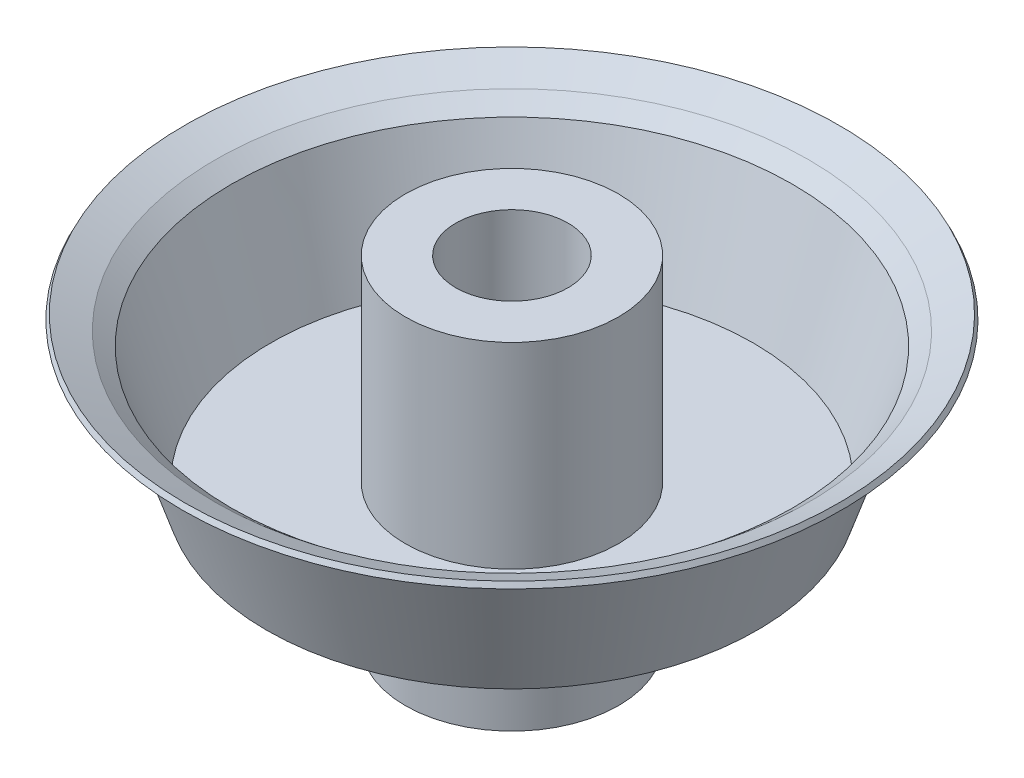
ISO-10303-21;
HEADER;
FILE_DESCRIPTION(('STEP AP214'),'2;1');
FILE_NAME('part.step','',(''),(''),'','','');
FILE_SCHEMA(('AUTOMOTIVE_DESIGN { 1 0 10303 214 1 1 1 1 }'));
ENDSEC;
DATA;
#1=APPLICATION_CONTEXT('core data for automotive mechanical design processes');
#2=APPLICATION_PROTOCOL_DEFINITION('international standard','automotive_design',2000,#1);
#3=PRODUCT_CONTEXT('',#1,'mechanical');
#4=PRODUCT('Part','Part','',(#3));
#5=PRODUCT_RELATED_PRODUCT_CATEGORY('part','',(#4));
#6=PRODUCT_DEFINITION_FORMATION('','',#4);
#7=PRODUCT_DEFINITION_CONTEXT('part definition',#1,'design');
#8=PRODUCT_DEFINITION('design','',#6,#7);
#9=PRODUCT_DEFINITION_SHAPE('','',#8);
#10=(LENGTH_UNIT() NAMED_UNIT(*) SI_UNIT(.MILLI.,.METRE.));
#11=(NAMED_UNIT(*) PLANE_ANGLE_UNIT() SI_UNIT($,.RADIAN.));
#12=(NAMED_UNIT(*) SI_UNIT($,.STERADIAN.) SOLID_ANGLE_UNIT());
#13=UNCERTAINTY_MEASURE_WITH_UNIT(LENGTH_MEASURE(1.E-05),#10,'distance_accuracy_value','');
#14=(GEOMETRIC_REPRESENTATION_CONTEXT(3) GLOBAL_UNCERTAINTY_ASSIGNED_CONTEXT((#13)) GLOBAL_UNIT_ASSIGNED_CONTEXT((#10,
#11,#12)) REPRESENTATION_CONTEXT('',''));
#15=CARTESIAN_POINT('',(0.,0.,0.));
#16=DIRECTION('',(0.,0.,1.));
#17=DIRECTION('',(1.,0.,0.));
#18=AXIS2_PLACEMENT_3D('',#15,#16,#17);
#19=CARTESIAN_POINT('',(0.,22.482072549379,0.));
#20=DIRECTION('',(0.,1.,0.));
#21=DIRECTION('',(0.,0.,1.));
#22=AXIS2_PLACEMENT_3D('',#19,#20,#21);
#23=CONICAL_SURFACE('',#22,53.4284746095807,1.11990759501973);
#24=CARTESIAN_POINT('',(0.,25.052946122985,0.));
#25=DIRECTION('',(0.,1.,0.));
#26=DIRECTION('',(0.,0.,1.));
#27=AXIS2_PLACEMENT_3D('',#24,#25,#26);
#28=CIRCLE('',#27,58.738533119433);
#29=CARTESIAN_POINT('',(0.,25.052946122985,58.738533119433));
#30=VERTEX_POINT('',#29);
#31=EDGE_CURVE('E62',#30,#30,#28,.T.);
#32=ORIENTED_EDGE('',*,*,#31,.F.);
#33=EDGE_LOOP('',(#32));
#34=FACE_BOUND('',#33,.T.);
#35=CARTESIAN_POINT('',(0.,22.482072549379,0.));
#36=DIRECTION('',(0.,1.,0.));
#37=DIRECTION('',(0.,0.,1.));
#38=AXIS2_PLACEMENT_3D('',#35,#36,#37);
#39=CIRCLE('',#38,53.4284746095807);
#40=CARTESIAN_POINT('',(0.,22.482072549379,53.4284746095807));
#41=VERTEX_POINT('',#40);
#42=EDGE_CURVE('E10',#41,#41,#39,.T.);
#43=ORIENTED_EDGE('',*,*,#42,.T.);
#44=EDGE_LOOP('',(#43));
#45=FACE_BOUND('',#44,.T.);
#46=ADVANCED_FACE('F31',(#34,#45),#23,.T.);
#47=CARTESIAN_POINT('',(0.,20.4058385928895,0.));
#48=DIRECTION('',(0.,1.,0.));
#49=DIRECTION('',(0.,0.,1.));
#50=AXIS2_PLACEMENT_3D('',#47,#48,#49);
#51=CONICAL_SURFACE('',#50,50.8560387510196,0.891736147908962);
#52=ORIENTED_EDGE('',*,*,#42,.F.);
#53=EDGE_LOOP('',(#52));
#54=FACE_BOUND('',#53,.T.);
#55=CARTESIAN_POINT('',(0.,20.4058385928895,0.));
#56=DIRECTION('',(0.,1.,0.));
#57=DIRECTION('',(0.,0.,1.));
#58=AXIS2_PLACEMENT_3D('',#55,#56,#57);
#59=CIRCLE('',#58,50.8560387510196);
#60=CARTESIAN_POINT('',(0.,20.4058385928895,50.8560387510196));
#61=VERTEX_POINT('',#60);
#62=EDGE_CURVE('E37',#61,#61,#59,.T.);
#63=ORIENTED_EDGE('',*,*,#62,.T.);
#64=EDGE_LOOP('',(#63));
#65=FACE_BOUND('',#64,.T.);
#66=ADVANCED_FACE('F100',(#54,#65),#51,.T.);
#67=CARTESIAN_POINT('',(0.,-1.00000000000821,0.));
#68=DIRECTION('',(0.,1.,0.));
#69=DIRECTION('',(0.,0.,1.));
#70=AXIS2_PLACEMENT_3D('',#67,#68,#69);
#71=CONICAL_SURFACE('',#70,43.7207592200747,0.321750554395756);
#72=ORIENTED_EDGE('',*,*,#62,.F.);
#73=EDGE_LOOP('',(#72));
#74=FACE_BOUND('',#73,.T.);
#75=CARTESIAN_POINT('',(0.,-1.00000000000821,0.));
#76=DIRECTION('',(0.,1.,0.));
#77=DIRECTION('',(0.,0.,1.));
#78=AXIS2_PLACEMENT_3D('',#75,#76,#77);
#79=CIRCLE('',#78,43.7207592200747);
#80=CARTESIAN_POINT('',(0.,-1.00000000000821,43.7207592200747));
#81=VERTEX_POINT('',#80);
#82=EDGE_CURVE('E41',#81,#81,#79,.T.);
#83=ORIENTED_EDGE('',*,*,#82,.T.);
#84=EDGE_LOOP('',(#83));
#85=FACE_BOUND('',#84,.T.);
#86=ADVANCED_FACE('F105',(#74,#85),#71,.T.);
#87=CARTESIAN_POINT('',(19.0000000000179,-1.00000000000821,0.));
#88=DIRECTION('',(0.,1.,0.));
#89=DIRECTION('',(0.,0.,1.));
#90=AXIS2_PLACEMENT_3D('',#87,#88,#89);
#91=PLANE('',#90);
#92=ORIENTED_EDGE('',*,*,#82,.F.);
#93=EDGE_LOOP('',(#92));
#94=FACE_BOUND('',#93,.T.);
#95=CARTESIAN_POINT('',(0.,-1.00000000000821,0.));
#96=DIRECTION('',(0.,1.,0.));
#97=DIRECTION('',(0.,0.,1.));
#98=AXIS2_PLACEMENT_3D('',#95,#96,#97);
#99=CIRCLE('',#98,19.0000000000179);
#100=CARTESIAN_POINT('',(0.,-1.00000000000821,19.0000000000179));
#101=VERTEX_POINT('',#100);
#102=EDGE_CURVE('E65',#101,#101,#99,.F.);
#103=ORIENTED_EDGE('',*,*,#102,.F.);
#104=EDGE_LOOP('',(#103));
#105=FACE_BOUND('',#104,.T.);
#106=ADVANCED_FACE('F136',(#94,#105),#91,.F.);
#107=CARTESIAN_POINT('',(19.0000000000179,-8.20985384275657E-12,0.));
#108=DIRECTION('',(0.,1.,0.));
#109=DIRECTION('',(0.,0.,1.));
#110=AXIS2_PLACEMENT_3D('',#107,#108,#109);
#111=PLANE('',#110);
#112=CARTESIAN_POINT('',(0.,-8.20985384275657E-12,0.));
#113=DIRECTION('',(0.,1.,0.));
#114=DIRECTION('',(0.,0.,1.));
#115=AXIS2_PLACEMENT_3D('',#112,#113,#114);
#116=CIRCLE('',#115,43.0000000000179);
#117=CARTESIAN_POINT('',(0.,-8.20985384275657E-12,43.0000000000179));
#118=VERTEX_POINT('',#117);
#119=EDGE_CURVE('E50',#118,#118,#116,.T.);
#120=ORIENTED_EDGE('',*,*,#119,.T.);
#121=EDGE_LOOP('',(#120));
#122=FACE_BOUND('',#121,.T.);
#123=CARTESIAN_POINT('',(0.,-8.20985384275657E-12,0.));
#124=DIRECTION('',(0.,1.,0.));
#125=DIRECTION('',(0.,0.,1.));
#126=AXIS2_PLACEMENT_3D('',#123,#124,#125);
#127=CIRCLE('',#126,19.0000000000179);
#128=CARTESIAN_POINT('',(0.,-8.20985384275657E-12,19.0000000000179));
#129=VERTEX_POINT('',#128);
#130=EDGE_CURVE('E45',#129,#129,#127,.T.);
#131=ORIENTED_EDGE('',*,*,#130,.F.);
#132=EDGE_LOOP('',(#131));
#133=FACE_BOUND('',#132,.T.);
#134=ADVANCED_FACE('F130',(#122,#133),#111,.T.);
#135=CARTESIAN_POINT('',(0.,-8.20985384275657E-12,0.));
#136=DIRECTION('',(0.,1.,0.));
#137=DIRECTION('',(0.,0.,1.));
#138=AXIS2_PLACEMENT_3D('',#135,#136,#137);
#139=CONICAL_SURFACE('',#138,43.0000000000179,0.321750554395756);
#140=CARTESIAN_POINT('',(0.,21.,0.));
#141=DIRECTION('',(0.,1.,0.));
#142=DIRECTION('',(0.,0.,1.));
#143=AXIS2_PLACEMENT_3D('',#140,#141,#142);
#144=CIRCLE('',#143,50.);
#145=CARTESIAN_POINT('',(0.,21.,50.));
#146=VERTEX_POINT('',#145);
#147=EDGE_CURVE('E53',#146,#146,#144,.T.);
#148=ORIENTED_EDGE('',*,*,#147,.T.);
#149=EDGE_LOOP('',(#148));
#150=FACE_BOUND('',#149,.T.);
#151=ORIENTED_EDGE('',*,*,#119,.F.);
#152=EDGE_LOOP('',(#151));
#153=FACE_BOUND('',#152,.T.);
#154=ADVANCED_FACE('F124',(#150,#153),#139,.F.);
#155=CARTESIAN_POINT('',(0.,21.,0.));
#156=DIRECTION('',(0.,1.,0.));
#157=DIRECTION('',(0.,0.,1.));
#158=AXIS2_PLACEMENT_3D('',#155,#156,#157);
#159=CONICAL_SURFACE('',#158,50.,0.891736147908962);
#160=CARTESIAN_POINT('',(0.,23.332201275954,0.));
#161=DIRECTION('',(0.,1.,0.));
#162=DIRECTION('',(0.,0.,1.));
#163=AXIS2_PLACEMENT_3D('',#160,#161,#162);
#164=CIRCLE('',#163,52.8895771465901);
#165=CARTESIAN_POINT('',(0.,23.332201275954,52.8895771465901));
#166=VERTEX_POINT('',#165);
#167=EDGE_CURVE('E56',#166,#166,#164,.T.);
#168=ORIENTED_EDGE('',*,*,#167,.T.);
#169=EDGE_LOOP('',(#168));
#170=FACE_BOUND('',#169,.T.);
#171=ORIENTED_EDGE('',*,*,#147,.F.);
#172=EDGE_LOOP('',(#171));
#173=FACE_BOUND('',#172,.T.);
#174=ADVANCED_FACE('F118',(#170,#173),#159,.F.);
#175=CARTESIAN_POINT('',(0.,23.332201275954,0.));
#176=DIRECTION('',(0.,1.,0.));
#177=DIRECTION('',(0.,0.,1.));
#178=AXIS2_PLACEMENT_3D('',#175,#176,#177);
#179=CONICAL_SURFACE('',#178,52.8895771465901,1.11990759501973);
#180=CARTESIAN_POINT('',(0.,25.9530063020908,0.));
#181=DIRECTION('',(0.,1.,0.));
#182=DIRECTION('',(0.,0.,1.));
#183=AXIS2_PLACEMENT_3D('',#180,#181,#182);
#184=CIRCLE('',#183,58.3027675012528);
#185=CARTESIAN_POINT('',(0.,25.9530063020908,58.3027675012528));
#186=VERTEX_POINT('',#185);
#187=EDGE_CURVE('E59',#186,#186,#184,.T.);
#188=ORIENTED_EDGE('',*,*,#187,.T.);
#189=EDGE_LOOP('',(#188));
#190=FACE_BOUND('',#189,.T.);
#191=ORIENTED_EDGE('',*,*,#167,.F.);
#192=EDGE_LOOP('',(#191));
#193=FACE_BOUND('',#192,.T.);
#194=ADVANCED_FACE('F112',(#190,#193),#179,.F.);
#195=CARTESIAN_POINT('',(0.,25.9530063020908,0.));
#196=DIRECTION('',(0.,-1.,0.));
#197=DIRECTION('',(0.,0.,-1.));
#198=AXIS2_PLACEMENT_3D('',#195,#196,#197);
#199=CONICAL_SURFACE('',#198,58.3027675012528,0.450888731775172);
#200=ORIENTED_EDGE('',*,*,#31,.T.);
#201=EDGE_LOOP('',(#200));
#202=FACE_BOUND('',#201,.T.);
#203=ORIENTED_EDGE('',*,*,#187,.F.);
#204=EDGE_LOOP('',(#203));
#205=FACE_BOUND('',#204,.T.);
#206=ADVANCED_FACE('F109',(#202,#205),#199,.T.);
#207=CARTESIAN_POINT('',(0.,35.,0.));
#208=DIRECTION('',(0.,-1.,0.));
#209=DIRECTION('',(0.,0.,-1.));
#210=AXIS2_PLACEMENT_3D('',#207,#208,#209);
#211=CYLINDRICAL_SURFACE('',#210,19.0000000000179);
#212=CARTESIAN_POINT('',(0.,-25.,0.));
#213=DIRECTION('',(0.,1.,0.));
#214=DIRECTION('',(0.,0.,1.));
#215=AXIS2_PLACEMENT_3D('',#212,#213,#214);
#216=CIRCLE('',#215,19.0000000000179);
#217=CARTESIAN_POINT('',(0.,-25.,19.0000000000179));
#218=VERTEX_POINT('',#217);
#219=EDGE_CURVE('E74',#218,#218,#216,.T.);
#220=ORIENTED_EDGE('',*,*,#219,.T.);
#221=EDGE_LOOP('',(#220));
#222=FACE_BOUND('',#221,.T.);
#223=ORIENTED_EDGE('',*,*,#102,.T.);
#224=EDGE_LOOP('',(#223));
#225=FACE_BOUND('',#224,.T.);
#226=ADVANCED_FACE('F97',(#222,#225),#211,.T.);
#227=CARTESIAN_POINT('',(0.,35.,0.));
#228=DIRECTION('',(0.,1.,0.));
#229=DIRECTION('',(0.,0.,1.));
#230=AXIS2_PLACEMENT_3D('',#227,#228,#229);
#231=PLANE('',#230);
#232=CARTESIAN_POINT('',(0.,35.,0.));
#233=DIRECTION('',(0.,1.,0.));
#234=DIRECTION('',(0.,0.,1.));
#235=AXIS2_PLACEMENT_3D('',#232,#233,#234);
#236=CIRCLE('',#235,19.0000000000179);
#237=CARTESIAN_POINT('',(0.,35.,19.0000000000179));
#238=VERTEX_POINT('',#237);
#239=EDGE_CURVE('E68',#238,#238,#236,.T.);
#240=ORIENTED_EDGE('',*,*,#239,.T.);
#241=EDGE_LOOP('',(#240));
#242=FACE_BOUND('',#241,.T.);
#243=CARTESIAN_POINT('',(0.,35.,0.));
#244=DIRECTION('',(0.,1.,0.));
#245=DIRECTION('',(0.,0.,1.));
#246=AXIS2_PLACEMENT_3D('',#243,#244,#245);
#247=CIRCLE('',#246,10.);
#248=CARTESIAN_POINT('',(0.,35.,10.));
#249=VERTEX_POINT('',#248);
#250=EDGE_CURVE('E71',#249,#249,#247,.T.);
#251=ORIENTED_EDGE('',*,*,#250,.F.);
#252=EDGE_LOOP('',(#251));
#253=FACE_BOUND('',#252,.T.);
#254=ADVANCED_FACE('F94',(#242,#253),#231,.T.);
#255=ORIENTED_EDGE('',*,*,#130,.T.);
#256=EDGE_LOOP('',(#255));
#257=FACE_BOUND('',#256,.T.);
#258=ORIENTED_EDGE('',*,*,#239,.F.);
#259=EDGE_LOOP('',(#258));
#260=FACE_BOUND('',#259,.T.);
#261=ADVANCED_FACE('F86',(#257,#260),#211,.T.);
#262=CARTESIAN_POINT('',(0.,35.,0.));
#263=DIRECTION('',(0.,-1.,0.));
#264=DIRECTION('',(0.,0.,-1.));
#265=AXIS2_PLACEMENT_3D('',#262,#263,#264);
#266=CYLINDRICAL_SURFACE('',#265,10.);
#267=ORIENTED_EDGE('',*,*,#250,.T.);
#268=EDGE_LOOP('',(#267));
#269=FACE_BOUND('',#268,.T.);
#270=CARTESIAN_POINT('',(0.,-25.,0.));
#271=DIRECTION('',(0.,1.,0.));
#272=DIRECTION('',(0.,0.,1.));
#273=AXIS2_PLACEMENT_3D('',#270,#271,#272);
#274=CIRCLE('',#273,10.);
#275=CARTESIAN_POINT('',(0.,-25.,10.));
#276=VERTEX_POINT('',#275);
#277=EDGE_CURVE('E77',#276,#276,#274,.T.);
#278=ORIENTED_EDGE('',*,*,#277,.F.);
#279=EDGE_LOOP('',(#278));
#280=FACE_BOUND('',#279,.T.);
#281=ADVANCED_FACE('F84',(#269,#280),#266,.F.);
#282=CARTESIAN_POINT('',(0.,-25.,0.));
#283=DIRECTION('',(0.,1.,0.));
#284=DIRECTION('',(0.,0.,1.));
#285=AXIS2_PLACEMENT_3D('',#282,#283,#284);
#286=PLANE('',#285);
#287=ORIENTED_EDGE('',*,*,#277,.T.);
#288=EDGE_LOOP('',(#287));
#289=FACE_BOUND('',#288,.T.);
#290=ORIENTED_EDGE('',*,*,#219,.F.);
#291=EDGE_LOOP('',(#290));
#292=FACE_BOUND('',#291,.T.);
#293=ADVANCED_FACE('F81',(#289,#292),#286,.F.);
#294=CLOSED_SHELL('',(#46,#66,#86,#106,#134,#154,#174,#194,#206,#226,#254,#261,#281,#293));
#295=MANIFOLD_SOLID_BREP('B2',#294);
#296=ADVANCED_BREP_SHAPE_REPRESENTATION('',(#18,#295),#14);
#297=SHAPE_DEFINITION_REPRESENTATION(#9,#296);
ENDSEC;
END-ISO-10303-21;
